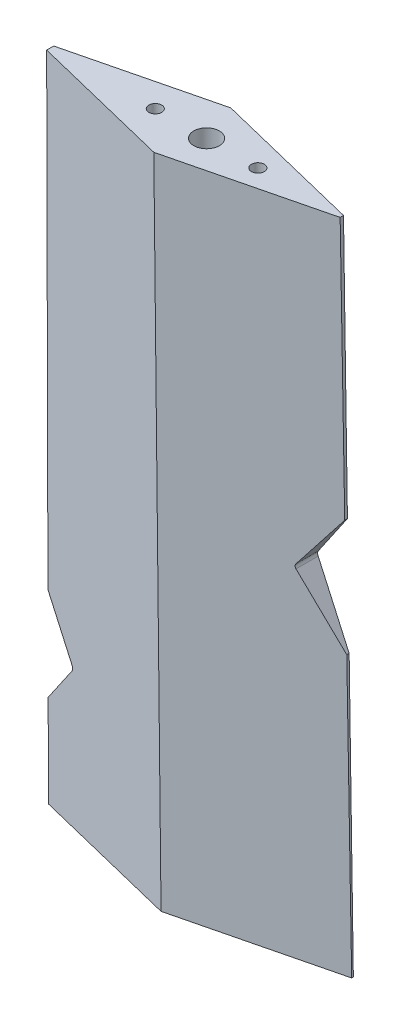
ISO-10303-21;
HEADER;
FILE_DESCRIPTION(('STEP AP214'),'2;1');
FILE_NAME('part.step','',(''),(''),'','','');
FILE_SCHEMA(('AUTOMOTIVE_DESIGN { 1 0 10303 214 1 1 1 1 }'));
ENDSEC;
DATA;
#1=APPLICATION_CONTEXT('core data for automotive mechanical design processes');
#2=APPLICATION_PROTOCOL_DEFINITION('international standard','automotive_design',2000,#1);
#3=PRODUCT_CONTEXT('',#1,'mechanical');
#4=PRODUCT('Part','Part','',(#3));
#5=PRODUCT_RELATED_PRODUCT_CATEGORY('part','',(#4));
#6=PRODUCT_DEFINITION_FORMATION('','',#4);
#7=PRODUCT_DEFINITION_CONTEXT('part definition',#1,'design');
#8=PRODUCT_DEFINITION('design','',#6,#7);
#9=PRODUCT_DEFINITION_SHAPE('','',#8);
#10=(LENGTH_UNIT() NAMED_UNIT(*) SI_UNIT(.MILLI.,.METRE.));
#11=(NAMED_UNIT(*) PLANE_ANGLE_UNIT() SI_UNIT($,.RADIAN.));
#12=(NAMED_UNIT(*) SI_UNIT($,.STERADIAN.) SOLID_ANGLE_UNIT());
#13=UNCERTAINTY_MEASURE_WITH_UNIT(LENGTH_MEASURE(1.E-05),#10,'distance_accuracy_value','');
#14=(GEOMETRIC_REPRESENTATION_CONTEXT(3) GLOBAL_UNCERTAINTY_ASSIGNED_CONTEXT((#13)) GLOBAL_UNIT_ASSIGNED_CONTEXT((#10,
#11,#12)) REPRESENTATION_CONTEXT('',''));
#15=CARTESIAN_POINT('',(0.,0.,0.));
#16=DIRECTION('',(0.,0.,1.));
#17=DIRECTION('',(1.,0.,0.));
#18=AXIS2_PLACEMENT_3D('',#15,#16,#17);
#19=CARTESIAN_POINT('',(134.681996719391,219.836565958458,-9.525));
#20=DIRECTION('',(0.999866416510167,0.0163446974617832,0.));
#21=DIRECTION('',(-0.0163446974617832,0.999866416510167,0.));
#22=AXIS2_PLACEMENT_3D('',#19,#20,#21);
#23=PLANE('',#22);
#24=DIRECTION('',(-0.0163446836309879,0.999865570428571,0.00130091834944232));
#25=VECTOR('',#24,1.);
#26=CARTESIAN_POINT('',(134.682199250408,219.824176376929,-1.61200009608092E-05));
#27=LINE('',#26,#25);
#28=CARTESIAN_POINT('',(132.097385652102,377.946914098348,0.205716307486944));
#29=VERTEX_POINT('',#28);
#30=CARTESIAN_POINT('',(130.972260191043,446.775056405867,0.29526813918717));
#31=VERTEX_POINT('',#30);
#32=EDGE_CURVE('E163',#29,#31,#27,.T.);
#33=ORIENTED_EDGE('',*,*,#32,.F.);
#34=DIRECTION('',(0.,0.,-1.));
#35=VECTOR('',#34,1.);
#36=CARTESIAN_POINT('',(132.097385652102,377.946914098348,-9.525));
#37=LINE('',#36,#35);
#38=CARTESIAN_POINT('',(132.097385652102,377.946914098348,-0.20571630748695));
#39=VERTEX_POINT('',#38);
#40=EDGE_CURVE('E192',#29,#39,#37,.T.);
#41=ORIENTED_EDGE('',*,*,#40,.T.);
#42=DIRECTION('',(0.0163446836309879,-0.999865570428571,0.00130091834944232));
#43=VECTOR('',#42,1.);
#44=CARTESIAN_POINT('',(134.681794188375,219.848955539986,-1.61200009590745E-05));
#45=LINE('',#44,#43);
#46=CARTESIAN_POINT('',(130.972260191043,446.775056405867,-0.295268139187183));
#47=VERTEX_POINT('',#46);
#48=EDGE_CURVE('E239',#47,#39,#45,.T.);
#49=ORIENTED_EDGE('',*,*,#48,.F.);
#50=DIRECTION('',(0.,0.,1.));
#51=VECTOR('',#50,1.);
#52=CARTESIAN_POINT('',(130.972260191043,446.775056405867,-9.52500000000005));
#53=LINE('',#52,#51);
#54=EDGE_CURVE('E201',#47,#31,#53,.T.);
#55=ORIENTED_EDGE('',*,*,#54,.T.);
#56=EDGE_LOOP('',(#33,#41,#49,#55));
#57=FACE_BOUND('',#56,.T.);
#58=ADVANCED_FACE('F33',(#57),#23,.T.);
#59=CARTESIAN_POINT('',(49.2246430956603,942.792954579603,0.));
#60=DIRECTION('',(0.238804060374286,0.00264025652948276,0.971064184178478));
#61=DIRECTION('',(0.971067568818316,0.,-0.238804892724763));
#62=AXIS2_PLACEMENT_3D('',#59,#60,#61);
#63=PLANE('',#62);
#64=DIRECTION('',(0.,0.999996303727557,-0.00271892096670104));
#65=VECTOR('',#64,1.);
#66=CARTESIAN_POINT('',(57.2177665065291,807.125541731836,-1.59679821194385));
#67=LINE('',#66,#65);
#68=CARTESIAN_POINT('',(57.2177665065291,423.998589411468,-0.555102457980421));
#69=VERTEX_POINT('',#68);
#70=CARTESIAN_POINT('',(57.2177665065291,539.871914098348,-0.870154034469396));
#71=VERTEX_POINT('',#70);
#72=EDGE_CURVE('E241',#69,#71,#67,.T.);
#73=ORIENTED_EDGE('',*,*,#72,.T.);
#74=DIRECTION('',(0.971067568818316,0.,-0.238804892724763));
#75=VECTOR('',#74,1.);
#76=CARTESIAN_POINT('',(49.4786881861133,539.871914098348,1.03303975702382));
#77=LINE('',#76,#75);
#78=CARTESIAN_POINT('',(92.411518754861,539.871914098348,-9.52500000000005));
#79=VERTEX_POINT('',#78);
#80=EDGE_CURVE('E144',#71,#79,#77,.T.);
#81=ORIENTED_EDGE('',*,*,#80,.T.);
#82=DIRECTION('',(0.0110554869516549,-0.999938886236685,0.));
#83=VECTOR('',#82,1.);
#84=CARTESIAN_POINT('',(87.9567582020914,942.792954579603,-9.525));
#85=LINE('',#84,#83);
#86=CARTESIAN_POINT('',(94.2017878895921,377.946914098348,-9.525));
#87=VERTEX_POINT('',#86);
#88=EDGE_CURVE('E58',#79,#87,#85,.T.);
#89=ORIENTED_EDGE('',*,*,#88,.T.);
#90=DIRECTION('',(0.971067568818316,0.,-0.238804892724763));
#91=VECTOR('',#90,1.);
#92=CARTESIAN_POINT('',(49.5807832547215,377.946914098348,1.4481954472213));
#93=LINE('',#92,#91);
#94=CARTESIAN_POINT('',(57.2177665065291,377.946914098348,-0.429891129604688));
#95=VERTEX_POINT('',#94);
#96=EDGE_CURVE('E186',#95,#87,#93,.T.);
#97=ORIENTED_EDGE('',*,*,#96,.F.);
#98=CARTESIAN_POINT('',(57.2177665065291,400.861282195755,-0.492193715750765));
#99=VERTEX_POINT('',#98);
#100=EDGE_CURVE('E242',#95,#99,#67,.T.);
#101=ORIENTED_EDGE('',*,*,#100,.T.);
#102=DIRECTION('',(-0.590805433978455,-0.793226419267353,0.147447573590831));
#103=VECTOR('',#102,1.);
#104=CARTESIAN_POINT('',(308.357084243052,738.045624600859,-63.1691443730078));
#105=LINE('',#104,#103);
#106=CARTESIAN_POINT('',(65.1276534778671,411.481244298731,-2.46626770733161));
#107=VERTEX_POINT('',#106);
#108=EDGE_CURVE('E228',#107,#99,#105,.T.);
#109=ORIENTED_EDGE('',*,*,#108,.F.);
#110=CARTESIAN_POINT('',(64.3637558147976,412.050205290678,-2.27995699417265));
#111=DIRECTION('',(0.238804060374286,0.00264025652948276,0.971064184178478));
#112=DIRECTION('',(-0.971004838791762,-0.0107355874174045,0.238818655481073));
#113=AXIS2_PLACEMENT_3D('',#110,#111,#112);
#114=ELLIPSE('',#113,0.980882639396234,0.952500000000136);
#115=CARTESIAN_POINT('',(65.1458488288728,412.593884210018,-2.47376749839539));
#116=VERTEX_POINT('',#115);
#117=EDGE_CURVE('E236',#116,#107,#114,.F.);
#118=ORIENTED_EDGE('',*,*,#117,.F.);
#119=DIRECTION('',(0.565422398289262,-0.813371444013876,-0.136837149837325));
#120=VECTOR('',#119,1.);
#121=CARTESIAN_POINT('',(-183.97331902332,770.956796433762,57.8152429862953));
#122=LINE('',#121,#120);
#123=EDGE_CURVE('E234',#69,#116,#122,.T.);
#124=ORIENTED_EDGE('',*,*,#123,.F.);
#125=EDGE_LOOP('',(#73,#81,#89,#97,#101,#109,#118,#124));
#126=FACE_BOUND('',#125,.T.);
#127=ADVANCED_FACE('F248',(#126),#63,.F.);
#128=CARTESIAN_POINT('',(88.8309804853994,863.721914098348,9.525));
#129=DIRECTION('',(0.238804060374286,0.00264025652948278,-0.971064184178478));
#130=DIRECTION('',(-0.971067568818316,0.,-0.238804892724763));
#131=AXIS2_PLACEMENT_3D('',#128,#129,#130);
#132=PLANE('',#131);
#133=DIRECTION('',(0.0110554869516549,-0.999938886236685,0.));
#134=VECTOR('',#133,1.);
#135=CARTESIAN_POINT('',(88.751463048907,870.914051109623,9.525));
#136=LINE('',#135,#134);
#137=CARTESIAN_POINT('',(92.4115187548611,539.871914098348,9.52500000000001));
#138=VERTEX_POINT('',#137);
#139=CARTESIAN_POINT('',(94.2017878895921,377.946914098348,9.52500000000001));
#140=VERTEX_POINT('',#139);
#141=EDGE_CURVE('E150',#138,#140,#136,.T.);
#142=ORIENTED_EDGE('',*,*,#141,.F.);
#143=DIRECTION('',(-0.971067568818316,0.,-0.238804892724763));
#144=VECTOR('',#143,1.);
#145=CARTESIAN_POINT('',(89.0351706226157,539.871914098348,8.69468861960503));
#146=LINE('',#145,#144);
#147=CARTESIAN_POINT('',(57.2177665065291,539.871914098348,0.870154034469399));
#148=VERTEX_POINT('',#147);
#149=EDGE_CURVE('E136',#138,#148,#146,.T.);
#150=ORIENTED_EDGE('',*,*,#149,.T.);
#151=DIRECTION('',(0.,-0.999996303727557,-0.00271892096670106));
#152=VECTOR('',#151,1.);
#153=CARTESIAN_POINT('',(57.2177665065291,807.073746478871,1.59665738422406));
#154=LINE('',#153,#152);
#155=CARTESIAN_POINT('',(57.2177665065291,423.998589411468,0.555102457980419));
#156=VERTEX_POINT('',#155);
#157=EDGE_CURVE('E161',#148,#156,#154,.T.);
#158=ORIENTED_EDGE('',*,*,#157,.T.);
#159=DIRECTION('',(-0.565422398289262,0.813371444013876,-0.136837149837325));
#160=VECTOR('',#159,1.);
#161=CARTESIAN_POINT('',(-134.209470051229,699.370503035085,-45.7719576851134));
#162=LINE('',#161,#160);
#163=CARTESIAN_POINT('',(65.1458488288728,412.593884210018,2.47376749839539));
#164=VERTEX_POINT('',#163);
#165=EDGE_CURVE('E231',#164,#156,#162,.T.);
#166=ORIENTED_EDGE('',*,*,#165,.F.);
#167=CARTESIAN_POINT('',(64.3637558147976,412.050205290678,2.27995699417265));
#168=DIRECTION('',(0.238804060374286,0.00264025652948278,-0.971064184178478));
#169=DIRECTION('',(0.971004838791762,0.0107355874174046,0.238818655481073));
#170=AXIS2_PLACEMENT_3D('',#167,#168,#169);
#171=ELLIPSE('',#170,0.980882639396235,0.952500000000136);
#172=CARTESIAN_POINT('',(65.1276534778671,411.481244298731,2.46626770733162));
#173=VERTEX_POINT('',#172);
#174=EDGE_CURVE('E175',#173,#164,#171,.F.);
#175=ORIENTED_EDGE('',*,*,#174,.F.);
#176=DIRECTION('',(0.590805433978455,0.793226419267353,0.147447573590831));
#177=VECTOR('',#176,1.);
#178=CARTESIAN_POINT('',(285.955419589327,707.968730894513,57.5783510125873));
#179=LINE('',#178,#177);
#180=CARTESIAN_POINT('',(57.2177665065291,400.861282195755,0.492193715750763));
#181=VERTEX_POINT('',#180);
#182=EDGE_CURVE('E226',#181,#173,#179,.T.);
#183=ORIENTED_EDGE('',*,*,#182,.F.);
#184=CARTESIAN_POINT('',(57.2177665065291,377.946914098348,0.429891129604686));
#185=VERTEX_POINT('',#184);
#186=EDGE_CURVE('E165',#181,#185,#154,.T.);
#187=ORIENTED_EDGE('',*,*,#186,.T.);
#188=DIRECTION('',(-0.971067568818316,0.,-0.238804892724763));
#189=VECTOR('',#188,1.);
#190=CARTESIAN_POINT('',(89.1372656912239,377.946914098348,8.27953292940755));
#191=LINE('',#190,#189);
#192=EDGE_CURVE('E160',#140,#185,#191,.T.);
#193=ORIENTED_EDGE('',*,*,#192,.F.);
#194=EDGE_LOOP('',(#142,#150,#158,#166,#175,#183,#187,#193));
#195=FACE_BOUND('',#194,.T.);
#196=ADVANCED_FACE('F158',(#195),#132,.F.);
#197=CARTESIAN_POINT('',(57.2177665065291,807.103985498089,-9.525));
#198=DIRECTION('',(-1.,0.,0.));
#199=DIRECTION('',(0.,0.,1.));
#200=AXIS2_PLACEMENT_3D('',#197,#198,#199);
#201=PLANE('',#200);
#202=ORIENTED_EDGE('',*,*,#100,.F.);
#203=DIRECTION('',(0.,0.,1.));
#204=VECTOR('',#203,1.);
#205=CARTESIAN_POINT('',(57.2177665065291,377.946914098348,-9.525));
#206=LINE('',#205,#204);
#207=EDGE_CURVE('E197',#95,#185,#206,.T.);
#208=ORIENTED_EDGE('',*,*,#207,.T.);
#209=ORIENTED_EDGE('',*,*,#186,.F.);
#210=DIRECTION('',(0.,0.,-1.));
#211=VECTOR('',#210,1.);
#212=CARTESIAN_POINT('',(57.2177665065291,400.861282195755,-9.525));
#213=LINE('',#212,#211);
#214=EDGE_CURVE('E169',#181,#99,#213,.T.);
#215=ORIENTED_EDGE('',*,*,#214,.T.);
#216=EDGE_LOOP('',(#202,#208,#209,#215));
#217=FACE_BOUND('',#216,.T.);
#218=ADVANCED_FACE('F35',(#217),#201,.T.);
#219=CARTESIAN_POINT('',(88.751463048907,870.914051109623,9.525));
#220=DIRECTION('',(-0.238804060374287,-0.00264025652948276,-0.971064184178478));
#221=DIRECTION('',(-0.971067568818316,0.,0.238804892724763));
#222=AXIS2_PLACEMENT_3D('',#219,#220,#221);
#223=PLANE('',#222);
#224=CARTESIAN_POINT('',(130.504368951505,475.397717552514,0.332508890540961));
#225=VERTEX_POINT('',#224);
#226=CARTESIAN_POINT('',(129.450416924282,539.871914098348,0.416395832778686));
#227=VERTEX_POINT('',#226);
#228=EDGE_CURVE('E154',#225,#227,#27,.T.);
#229=ORIENTED_EDGE('',*,*,#228,.T.);
#230=DIRECTION('',(-0.971067568818316,0.,0.238804892724763));
#231=VECTOR('',#230,1.);
#232=CARTESIAN_POINT('',(88.9601878887425,539.871914098348,10.3737511309271));
#233=LINE('',#232,#231);
#234=EDGE_CURVE('E50',#227,#138,#233,.T.);
#235=ORIENTED_EDGE('',*,*,#234,.T.);
#236=ORIENTED_EDGE('',*,*,#141,.T.);
#237=DIRECTION('',(-0.971067568818316,0.,0.238804892724763));
#238=VECTOR('',#237,1.);
#239=CARTESIAN_POINT('',(89.0622829573506,377.946914098348,10.7889068211245));
#240=LINE('',#239,#238);
#241=EDGE_CURVE('E195',#29,#140,#240,.T.);
#242=ORIENTED_EDGE('',*,*,#241,.F.);
#243=ORIENTED_EDGE('',*,*,#32,.T.);
#244=DIRECTION('',(-0.56542239828926,0.813371444013877,0.136837149837325));
#245=VECTOR('',#244,1.);
#246=CARTESIAN_POINT('',(-78.3008042194719,747.818550805447,50.9411742056955));
#247=LINE('',#246,#245);
#248=CARTESIAN_POINT('',(120.845958336896,461.341944428959,2.74592147076072));
#249=VERTEX_POINT('',#248);
#250=EDGE_CURVE('E217',#31,#249,#247,.T.);
#251=ORIENTED_EDGE('',*,*,#250,.T.);
#252=CARTESIAN_POINT('',(121.628051350971,461.885623348299,2.55211096653797));
#253=DIRECTION('',(-0.238804060374287,-0.00264025652948276,-0.971064184178478));
#254=DIRECTION('',(-0.971004838791762,-0.0107355874174045,0.238818655481073));
#255=AXIS2_PLACEMENT_3D('',#252,#253,#254);
#256=ELLIPSE('',#255,0.980882639396235,0.952500000000137);
#257=CARTESIAN_POINT('',(120.864153687902,462.454584340246,2.73842167969695));
#258=VERTEX_POINT('',#257);
#259=EDGE_CURVE('E214',#249,#258,#256,.T.);
#260=ORIENTED_EDGE('',*,*,#259,.T.);
#261=DIRECTION('',(0.590805433978455,0.793226419267352,-0.147447573590831));
#262=VECTOR('',#261,1.);
#263=CARTESIAN_POINT('',(300.485443954866,703.617486216741,-42.0897432150831));
#264=LINE('',#263,#262);
#265=EDGE_CURVE('E204',#258,#225,#264,.T.);
#266=ORIENTED_EDGE('',*,*,#265,.T.);
#267=EDGE_LOOP('',(#229,#235,#236,#242,#243,#251,#260,#266));
#268=FACE_BOUND('',#267,.T.);
#269=ADVANCED_FACE('F148',(#268),#223,.F.);
#270=CARTESIAN_POINT('',(87.9567582020914,942.792954579603,-9.525));
#271=DIRECTION('',(-0.238804060374286,-0.00264025652948276,0.971064184178478));
#272=DIRECTION('',(0.971067568818316,0.,0.238804892724763));
#273=AXIS2_PLACEMENT_3D('',#270,#271,#272);
#274=PLANE('',#273);
#275=ORIENTED_EDGE('',*,*,#88,.F.);
#276=DIRECTION('',(0.971067568818316,0.,0.238804892724763));
#277=VECTOR('',#276,1.);
#278=CARTESIAN_POINT('',(88.2108032925445,539.871914098348,-10.5580397570238));
#279=LINE('',#278,#277);
#280=CARTESIAN_POINT('',(129.450416924282,539.871914098348,-0.416395832778695));
#281=VERTEX_POINT('',#280);
#282=EDGE_CURVE('E155',#79,#281,#279,.T.);
#283=ORIENTED_EDGE('',*,*,#282,.T.);
#284=CARTESIAN_POINT('',(130.504368951505,475.397717552514,-0.332508890541006));
#285=VERTEX_POINT('',#284);
#286=EDGE_CURVE('E240',#281,#285,#45,.T.);
#287=ORIENTED_EDGE('',*,*,#286,.T.);
#288=DIRECTION('',(-0.590805433978455,-0.793226419267353,-0.147447573590831));
#289=VECTOR('',#288,1.);
#290=CARTESIAN_POINT('',(333.893558886282,748.471845803565,50.4274212416879));
#291=LINE('',#290,#289);
#292=CARTESIAN_POINT('',(120.864153687902,462.454584340246,-2.73842167969696));
#293=VERTEX_POINT('',#292);
#294=EDGE_CURVE('E177',#285,#293,#291,.T.);
#295=ORIENTED_EDGE('',*,*,#294,.T.);
#296=CARTESIAN_POINT('',(121.628051350971,461.885623348299,-2.55211096653798));
#297=DIRECTION('',(-0.238804060374286,-0.00264025652948276,0.971064184178478));
#298=DIRECTION('',(0.971004838791762,0.0107355874174045,0.238818655481073));
#299=AXIS2_PLACEMENT_3D('',#296,#297,#298);
#300=ELLIPSE('',#299,0.980882639396235,0.952500000000137);
#301=CARTESIAN_POINT('',(120.845958336896,461.341944428959,-2.74592147076072));
#302=VERTEX_POINT('',#301);
#303=EDGE_CURVE('E42',#293,#302,#300,.T.);
#304=ORIENTED_EDGE('',*,*,#303,.T.);
#305=DIRECTION('',(0.56542239828926,-0.813371444013877,0.136837149837325));
#306=VECTOR('',#305,1.);
#307=CARTESIAN_POINT('',(-111.611868377617,795.737183738853,-59.0027421436478));
#308=LINE('',#307,#306);
#309=EDGE_CURVE('E11',#302,#47,#308,.T.);
#310=ORIENTED_EDGE('',*,*,#309,.T.);
#311=ORIENTED_EDGE('',*,*,#48,.T.);
#312=DIRECTION('',(0.971067568818316,0.,0.238804892724763));
#313=VECTOR('',#312,1.);
#314=CARTESIAN_POINT('',(88.3128983611527,377.946914098348,-10.9731954472213));
#315=LINE('',#314,#313);
#316=EDGE_CURVE('E183',#87,#39,#315,.T.);
#317=ORIENTED_EDGE('',*,*,#316,.F.);
#318=EDGE_LOOP('',(#275,#283,#287,#295,#304,#310,#311,#317));
#319=FACE_BOUND('',#318,.T.);
#320=ADVANCED_FACE('F277',(#319),#274,.F.);
#321=DIRECTION('',(0.,0.,1.));
#322=VECTOR('',#321,1.);
#323=CARTESIAN_POINT('',(57.2177665065291,539.871914098348,-9.525));
#324=LINE('',#323,#322);
#325=EDGE_CURVE('E140',#71,#148,#324,.T.);
#326=ORIENTED_EDGE('',*,*,#325,.F.);
#327=ORIENTED_EDGE('',*,*,#72,.F.);
#328=DIRECTION('',(0.,0.,1.));
#329=VECTOR('',#328,1.);
#330=CARTESIAN_POINT('',(57.2177665065291,423.998589411468,-9.525));
#331=LINE('',#330,#329);
#332=EDGE_CURVE('E172',#69,#156,#331,.T.);
#333=ORIENTED_EDGE('',*,*,#332,.T.);
#334=ORIENTED_EDGE('',*,*,#157,.F.);
#335=EDGE_LOOP('',(#326,#327,#333,#334));
#336=FACE_BOUND('',#335,.T.);
#337=ADVANCED_FACE('F251',(#336),#201,.T.);
#338=DIRECTION('',(0.,0.,-1.));
#339=VECTOR('',#338,1.);
#340=CARTESIAN_POINT('',(129.450416924282,539.871914098348,-9.525));
#341=LINE('',#340,#339);
#342=EDGE_CURVE('E287',#227,#281,#341,.T.);
#343=ORIENTED_EDGE('',*,*,#342,.F.);
#344=ORIENTED_EDGE('',*,*,#228,.F.);
#345=DIRECTION('',(0.,0.,1.));
#346=VECTOR('',#345,1.);
#347=CARTESIAN_POINT('',(130.504368951505,475.397717552514,-9.52500000000005));
#348=LINE('',#347,#346);
#349=EDGE_CURVE('E202',#285,#225,#348,.T.);
#350=ORIENTED_EDGE('',*,*,#349,.F.);
#351=ORIENTED_EDGE('',*,*,#286,.F.);
#352=EDGE_LOOP('',(#343,#344,#350,#351));
#353=FACE_BOUND('',#352,.T.);
#354=ADVANCED_FACE('F285',(#353),#23,.T.);
#355=CARTESIAN_POINT('',(64.3637558147976,412.050205290678,-9.52500000000005));
#356=DIRECTION('',(0.,0.,1.));
#357=DIRECTION('',(1.,0.,0.));
#358=AXIS2_PLACEMENT_3D('',#355,#356,#357);
#359=CYLINDRICAL_SURFACE('',#358,0.952500000000136);
#360=ORIENTED_EDGE('',*,*,#117,.T.);
#361=DIRECTION('',(0.,0.,1.));
#362=VECTOR('',#361,1.);
#363=CARTESIAN_POINT('',(65.1276534778671,411.481244298731,-9.52500000000005));
#364=LINE('',#363,#362);
#365=EDGE_CURVE('E223',#107,#173,#364,.T.);
#366=ORIENTED_EDGE('',*,*,#365,.T.);
#367=ORIENTED_EDGE('',*,*,#174,.T.);
#368=DIRECTION('',(0.,0.,1.));
#369=VECTOR('',#368,1.);
#370=CARTESIAN_POINT('',(65.1458488288728,412.593884210018,-9.52500000000005));
#371=LINE('',#370,#369);
#372=EDGE_CURVE('E220',#116,#164,#371,.T.);
#373=ORIENTED_EDGE('',*,*,#372,.F.);
#374=EDGE_LOOP('',(#360,#366,#367,#373));
#375=FACE_BOUND('',#374,.T.);
#376=ADVANCED_FACE('F258',(#375),#359,.F.);
#377=CARTESIAN_POINT('',(57.2177665065291,423.998589411468,-9.52500000000005));
#378=DIRECTION('',(-0.821095027900379,-0.570791516367645,0.));
#379=DIRECTION('',(0.570791516367645,-0.821095027900379,0.));
#380=AXIS2_PLACEMENT_3D('',#377,#378,#379);
#381=PLANE('',#380);
#382=ORIENTED_EDGE('',*,*,#123,.T.);
#383=ORIENTED_EDGE('',*,*,#372,.T.);
#384=ORIENTED_EDGE('',*,*,#165,.T.);
#385=ORIENTED_EDGE('',*,*,#332,.F.);
#386=EDGE_LOOP('',(#382,#383,#384,#385));
#387=FACE_BOUND('',#386,.T.);
#388=ADVANCED_FACE('F255',(#387),#381,.T.);
#389=CARTESIAN_POINT('',(65.1276534778671,411.481244298731,-9.52500000000005));
#390=DIRECTION('',(-0.801992297185679,0.597334374747375,0.));
#391=DIRECTION('',(-0.597334374747375,-0.801992297185679,0.));
#392=AXIS2_PLACEMENT_3D('',#389,#390,#391);
#393=PLANE('',#392);
#394=ORIENTED_EDGE('',*,*,#108,.T.);
#395=ORIENTED_EDGE('',*,*,#214,.F.);
#396=ORIENTED_EDGE('',*,*,#182,.T.);
#397=ORIENTED_EDGE('',*,*,#365,.F.);
#398=EDGE_LOOP('',(#394,#395,#396,#397));
#399=FACE_BOUND('',#398,.T.);
#400=ADVANCED_FACE('F261',(#399),#393,.T.);
#401=CARTESIAN_POINT('',(120.845958336896,461.341944428959,-9.52500000000005));
#402=DIRECTION('',(-0.821095027900381,-0.570791516367643,0.));
#403=DIRECTION('',(0.570791516367643,-0.821095027900381,0.));
#404=AXIS2_PLACEMENT_3D('',#401,#402,#403);
#405=PLANE('',#404);
#406=ORIENTED_EDGE('',*,*,#54,.F.);
#407=ORIENTED_EDGE('',*,*,#309,.F.);
#408=DIRECTION('',(0.,0.,1.));
#409=VECTOR('',#408,1.);
#410=CARTESIAN_POINT('',(120.845958336896,461.341944428959,-9.52500000000005));
#411=LINE('',#410,#409);
#412=EDGE_CURVE('E208',#302,#249,#411,.T.);
#413=ORIENTED_EDGE('',*,*,#412,.T.);
#414=ORIENTED_EDGE('',*,*,#250,.F.);
#415=EDGE_LOOP('',(#406,#407,#413,#414));
#416=FACE_BOUND('',#415,.T.);
#417=ADVANCED_FACE('F274',(#416),#405,.F.);
#418=CARTESIAN_POINT('',(121.628051350971,461.885623348299,-9.52500000000005));
#419=DIRECTION('',(0.,0.,1.));
#420=DIRECTION('',(1.,0.,0.));
#421=AXIS2_PLACEMENT_3D('',#418,#419,#420);
#422=CYLINDRICAL_SURFACE('',#421,0.952500000000137);
#423=ORIENTED_EDGE('',*,*,#412,.F.);
#424=ORIENTED_EDGE('',*,*,#303,.F.);
#425=DIRECTION('',(0.,0.,1.));
#426=VECTOR('',#425,1.);
#427=CARTESIAN_POINT('',(120.864153687902,462.454584340246,-9.52500000000005));
#428=LINE('',#427,#426);
#429=EDGE_CURVE('E205',#293,#258,#428,.T.);
#430=ORIENTED_EDGE('',*,*,#429,.T.);
#431=ORIENTED_EDGE('',*,*,#259,.F.);
#432=EDGE_LOOP('',(#423,#424,#430,#431));
#433=FACE_BOUND('',#432,.T.);
#434=ADVANCED_FACE('F281',(#433),#422,.F.);
#435=CARTESIAN_POINT('',(130.504368951505,475.397717552514,-9.52500000000005));
#436=DIRECTION('',(-0.801992297185679,0.597334374747375,0.));
#437=DIRECTION('',(-0.597334374747375,-0.801992297185679,0.));
#438=AXIS2_PLACEMENT_3D('',#435,#436,#437);
#439=PLANE('',#438);
#440=ORIENTED_EDGE('',*,*,#429,.F.);
#441=ORIENTED_EDGE('',*,*,#294,.F.);
#442=ORIENTED_EDGE('',*,*,#349,.T.);
#443=ORIENTED_EDGE('',*,*,#265,.F.);
#444=EDGE_LOOP('',(#440,#441,#442,#443));
#445=FACE_BOUND('',#444,.T.);
#446=ADVANCED_FACE('F330',(#445),#439,.F.);
#447=CARTESIAN_POINT('',(0.,377.946914098348,-9.52500000000005));
#448=DIRECTION('',(0.,-1.,0.));
#449=DIRECTION('',(0.,0.,-1.));
#450=AXIS2_PLACEMENT_3D('',#447,#448,#449);
#451=PLANE('',#450);
#452=CARTESIAN_POINT('',(108.64988161296,377.946914098348,0.));
#453=DIRECTION('',(0.,-1.,0.));
#454=DIRECTION('',(0.,0.,-1.));
#455=AXIS2_PLACEMENT_3D('',#452,#453,#454);
#456=CIRCLE('',#455,1.5875);
#457=CARTESIAN_POINT('',(108.64988161296,377.946914098348,-1.5875));
#458=VERTEX_POINT('',#457);
#459=EDGE_CURVE('E312',#458,#458,#456,.T.);
#460=ORIENTED_EDGE('',*,*,#459,.F.);
#461=EDGE_LOOP('',(#460));
#462=FACE_BOUND('',#461,.T.);
#463=CARTESIAN_POINT('',(83.2498816129603,377.946914098348,0.));
#464=DIRECTION('',(0.,-1.,0.));
#465=DIRECTION('',(0.,0.,-1.));
#466=AXIS2_PLACEMENT_3D('',#463,#464,#465);
#467=CIRCLE('',#466,1.5875);
#468=CARTESIAN_POINT('',(83.2498816129603,377.946914098348,-1.5875));
#469=VERTEX_POINT('',#468);
#470=EDGE_CURVE('E306',#469,#469,#467,.T.);
#471=ORIENTED_EDGE('',*,*,#470,.F.);
#472=EDGE_LOOP('',(#471));
#473=FACE_BOUND('',#472,.T.);
#474=CARTESIAN_POINT('',(95.9498816129603,377.946914098348,0.));
#475=DIRECTION('',(0.,-1.,0.));
#476=DIRECTION('',(0.,0.,-1.));
#477=AXIS2_PLACEMENT_3D('',#474,#475,#476);
#478=CIRCLE('',#477,3.175);
#479=CARTESIAN_POINT('',(95.9498816129603,377.946914098348,-3.175));
#480=VERTEX_POINT('',#479);
#481=EDGE_CURVE('E181',#480,#480,#478,.F.);
#482=ORIENTED_EDGE('',*,*,#481,.T.);
#483=EDGE_LOOP('',(#482));
#484=FACE_BOUND('',#483,.T.);
#485=ORIENTED_EDGE('',*,*,#192,.T.);
#486=ORIENTED_EDGE('',*,*,#207,.F.);
#487=ORIENTED_EDGE('',*,*,#96,.T.);
#488=ORIENTED_EDGE('',*,*,#316,.T.);
#489=ORIENTED_EDGE('',*,*,#40,.F.);
#490=ORIENTED_EDGE('',*,*,#241,.T.);
#491=EDGE_LOOP('',(#485,#486,#487,#488,#489,#490));
#492=FACE_BOUND('',#491,.T.);
#493=ADVANCED_FACE('F266',(#462,#473,#484,#492),#451,.T.);
#494=CARTESIAN_POINT('',(95.9498816129603,778.636565958458,0.));
#495=DIRECTION('',(0.,-1.,0.));
#496=DIRECTION('',(0.,0.,-1.));
#497=AXIS2_PLACEMENT_3D('',#494,#495,#496);
#498=CYLINDRICAL_SURFACE('',#497,3.175);
#499=CARTESIAN_POINT('',(95.9498816129603,539.871914098348,0.));
#500=DIRECTION('',(0.,-1.,0.));
#501=DIRECTION('',(0.,0.,-1.));
#502=AXIS2_PLACEMENT_3D('',#499,#500,#501);
#503=CIRCLE('',#502,3.175);
#504=CARTESIAN_POINT('',(95.9498816129603,539.871914098348,-3.175));
#505=VERTEX_POINT('',#504);
#506=EDGE_CURVE('E37',#505,#505,#503,.F.);
#507=ORIENTED_EDGE('',*,*,#506,.T.);
#508=EDGE_LOOP('',(#507));
#509=FACE_BOUND('',#508,.T.);
#510=ORIENTED_EDGE('',*,*,#481,.F.);
#511=EDGE_LOOP('',(#510));
#512=FACE_BOUND('',#511,.T.);
#513=ADVANCED_FACE('F329',(#509,#512),#498,.F.);
#514=CARTESIAN_POINT('',(0.,539.871914098348,-9.52500000000005));
#515=DIRECTION('',(0.,-1.,0.));
#516=DIRECTION('',(0.,0.,-1.));
#517=AXIS2_PLACEMENT_3D('',#514,#515,#516);
#518=PLANE('',#517);
#519=CARTESIAN_POINT('',(108.64988161296,539.871914098348,0.));
#520=DIRECTION('',(0.,1.,0.));
#521=DIRECTION('',(0.,0.,1.));
#522=AXIS2_PLACEMENT_3D('',#519,#520,#521);
#523=CIRCLE('',#522,1.5875);
#524=CARTESIAN_POINT('',(108.64988161296,539.871914098348,1.5875));
#525=VERTEX_POINT('',#524);
#526=EDGE_CURVE('E300',#525,#525,#523,.T.);
#527=ORIENTED_EDGE('',*,*,#526,.F.);
#528=EDGE_LOOP('',(#527));
#529=FACE_BOUND('',#528,.T.);
#530=CARTESIAN_POINT('',(83.2498816129603,539.871914098348,0.));
#531=DIRECTION('',(0.,1.,0.));
#532=DIRECTION('',(0.,0.,1.));
#533=AXIS2_PLACEMENT_3D('',#530,#531,#532);
#534=CIRCLE('',#533,1.5875);
#535=CARTESIAN_POINT('',(83.2498816129603,539.871914098348,1.5875));
#536=VERTEX_POINT('',#535);
#537=EDGE_CURVE('E294',#536,#536,#534,.T.);
#538=ORIENTED_EDGE('',*,*,#537,.F.);
#539=EDGE_LOOP('',(#538));
#540=FACE_BOUND('',#539,.T.);
#541=ORIENTED_EDGE('',*,*,#325,.T.);
#542=ORIENTED_EDGE('',*,*,#149,.F.);
#543=ORIENTED_EDGE('',*,*,#234,.F.);
#544=ORIENTED_EDGE('',*,*,#342,.T.);
#545=ORIENTED_EDGE('',*,*,#282,.F.);
#546=ORIENTED_EDGE('',*,*,#80,.F.);
#547=EDGE_LOOP('',(#541,#542,#543,#544,#545,#546));
#548=FACE_BOUND('',#547,.T.);
#549=ORIENTED_EDGE('',*,*,#506,.F.);
#550=EDGE_LOOP('',(#549));
#551=FACE_BOUND('',#550,.T.);
#552=ADVANCED_FACE('F137',(#529,#540,#548,#551),#518,.F.);
#553=CARTESIAN_POINT('',(83.2498816129603,527.171914098348,0.));
#554=DIRECTION('',(0.,1.,0.));
#555=DIRECTION('',(0.,0.,1.));
#556=AXIS2_PLACEMENT_3D('',#553,#554,#555);
#557=CYLINDRICAL_SURFACE('',#556,1.5875);
#558=CARTESIAN_POINT('',(83.2498816129603,527.171914098348,0.));
#559=DIRECTION('',(0.,1.,0.));
#560=DIRECTION('',(0.,0.,1.));
#561=AXIS2_PLACEMENT_3D('',#558,#559,#560);
#562=CIRCLE('',#561,1.5875);
#563=CARTESIAN_POINT('',(83.2498816129603,527.171914098348,1.5875));
#564=VERTEX_POINT('',#563);
#565=EDGE_CURVE('E292',#564,#564,#562,.T.);
#566=ORIENTED_EDGE('',*,*,#565,.F.);
#567=EDGE_LOOP('',(#566));
#568=FACE_BOUND('',#567,.T.);
#569=ORIENTED_EDGE('',*,*,#537,.T.);
#570=EDGE_LOOP('',(#569));
#571=FACE_BOUND('',#570,.T.);
#572=ADVANCED_FACE('F391',(#568,#571),#557,.F.);
#573=CARTESIAN_POINT('',(83.2498816129603,527.171914098348,0.));
#574=DIRECTION('',(0.,1.,0.));
#575=DIRECTION('',(0.,0.,1.));
#576=AXIS2_PLACEMENT_3D('',#573,#574,#575);
#577=PLANE('',#576);
#578=ORIENTED_EDGE('',*,*,#565,.T.);
#579=EDGE_LOOP('',(#578));
#580=FACE_BOUND('',#579,.T.);
#581=ADVANCED_FACE('F395',(#580),#577,.T.);
#582=CARTESIAN_POINT('',(108.64988161296,527.171914098348,0.));
#583=DIRECTION('',(0.,1.,0.));
#584=DIRECTION('',(0.,0.,1.));
#585=AXIS2_PLACEMENT_3D('',#582,#583,#584);
#586=CYLINDRICAL_SURFACE('',#585,1.5875);
#587=CARTESIAN_POINT('',(108.64988161296,527.171914098348,0.));
#588=DIRECTION('',(0.,1.,0.));
#589=DIRECTION('',(0.,0.,1.));
#590=AXIS2_PLACEMENT_3D('',#587,#588,#589);
#591=CIRCLE('',#590,1.5875);
#592=CARTESIAN_POINT('',(108.64988161296,527.171914098348,1.5875));
#593=VERTEX_POINT('',#592);
#594=EDGE_CURVE('E297',#593,#593,#591,.T.);
#595=ORIENTED_EDGE('',*,*,#594,.F.);
#596=EDGE_LOOP('',(#595));
#597=FACE_BOUND('',#596,.T.);
#598=ORIENTED_EDGE('',*,*,#526,.T.);
#599=EDGE_LOOP('',(#598));
#600=FACE_BOUND('',#599,.T.);
#601=ADVANCED_FACE('F345',(#597,#600),#586,.F.);
#602=CARTESIAN_POINT('',(108.64988161296,527.171914098348,0.));
#603=DIRECTION('',(0.,1.,0.));
#604=DIRECTION('',(0.,0.,1.));
#605=AXIS2_PLACEMENT_3D('',#602,#603,#604);
#606=PLANE('',#605);
#607=ORIENTED_EDGE('',*,*,#594,.T.);
#608=EDGE_LOOP('',(#607));
#609=FACE_BOUND('',#608,.T.);
#610=ADVANCED_FACE('F336',(#609),#606,.T.);
#611=CARTESIAN_POINT('',(83.2498816129603,390.646914098348,0.));
#612=DIRECTION('',(0.,-1.,0.));
#613=DIRECTION('',(0.,0.,-1.));
#614=AXIS2_PLACEMENT_3D('',#611,#612,#613);
#615=CYLINDRICAL_SURFACE('',#614,1.5875);
#616=CARTESIAN_POINT('',(83.2498816129603,390.646914098348,0.));
#617=DIRECTION('',(0.,-1.,0.));
#618=DIRECTION('',(0.,0.,-1.));
#619=AXIS2_PLACEMENT_3D('',#616,#617,#618);
#620=CIRCLE('',#619,1.5875);
#621=CARTESIAN_POINT('',(83.2498816129603,390.646914098348,-1.5875));
#622=VERTEX_POINT('',#621);
#623=EDGE_CURVE('E303',#622,#622,#620,.T.);
#624=ORIENTED_EDGE('',*,*,#623,.F.);
#625=EDGE_LOOP('',(#624));
#626=FACE_BOUND('',#625,.T.);
#627=ORIENTED_EDGE('',*,*,#470,.T.);
#628=EDGE_LOOP('',(#627));
#629=FACE_BOUND('',#628,.T.);
#630=ADVANCED_FACE('F334',(#626,#629),#615,.F.);
#631=CARTESIAN_POINT('',(83.2498816129603,390.646914098348,0.));
#632=DIRECTION('',(0.,-1.,0.));
#633=DIRECTION('',(0.,0.,-1.));
#634=AXIS2_PLACEMENT_3D('',#631,#632,#633);
#635=PLANE('',#634);
#636=ORIENTED_EDGE('',*,*,#623,.T.);
#637=EDGE_LOOP('',(#636));
#638=FACE_BOUND('',#637,.T.);
#639=ADVANCED_FACE('F323',(#638),#635,.T.);
#640=CARTESIAN_POINT('',(108.64988161296,390.646914098348,0.));
#641=DIRECTION('',(0.,-1.,0.));
#642=DIRECTION('',(0.,0.,-1.));
#643=AXIS2_PLACEMENT_3D('',#640,#641,#642);
#644=CYLINDRICAL_SURFACE('',#643,1.5875);
#645=CARTESIAN_POINT('',(108.64988161296,390.646914098348,0.));
#646=DIRECTION('',(0.,-1.,0.));
#647=DIRECTION('',(0.,0.,-1.));
#648=AXIS2_PLACEMENT_3D('',#645,#646,#647);
#649=CIRCLE('',#648,1.5875);
#650=CARTESIAN_POINT('',(108.64988161296,390.646914098348,-1.5875));
#651=VERTEX_POINT('',#650);
#652=EDGE_CURVE('E309',#651,#651,#649,.T.);
#653=ORIENTED_EDGE('',*,*,#652,.F.);
#654=EDGE_LOOP('',(#653));
#655=FACE_BOUND('',#654,.T.);
#656=ORIENTED_EDGE('',*,*,#459,.T.);
#657=EDGE_LOOP('',(#656));
#658=FACE_BOUND('',#657,.T.);
#659=ADVANCED_FACE('F320',(#655,#658),#644,.F.);
#660=CARTESIAN_POINT('',(108.64988161296,390.646914098348,0.));
#661=DIRECTION('',(0.,-1.,0.));
#662=DIRECTION('',(0.,0.,-1.));
#663=AXIS2_PLACEMENT_3D('',#660,#661,#662);
#664=PLANE('',#663);
#665=ORIENTED_EDGE('',*,*,#652,.T.);
#666=EDGE_LOOP('',(#665));
#667=FACE_BOUND('',#666,.T.);
#668=ADVANCED_FACE('F318',(#667),#664,.T.);
#669=CLOSED_SHELL('',(#58,#127,#196,#218,#269,#320,#337,#354,#376,#388,#400,#417,#434,#446,#493,
#513,#552,#572,#581,#601,#610,#630,#639,#659,#668));
#670=MANIFOLD_SOLID_BREP('B2',#669);
#671=ADVANCED_BREP_SHAPE_REPRESENTATION('',(#18,#670),#14);
#672=SHAPE_DEFINITION_REPRESENTATION(#9,#671);
ENDSEC;
END-ISO-10303-21;
